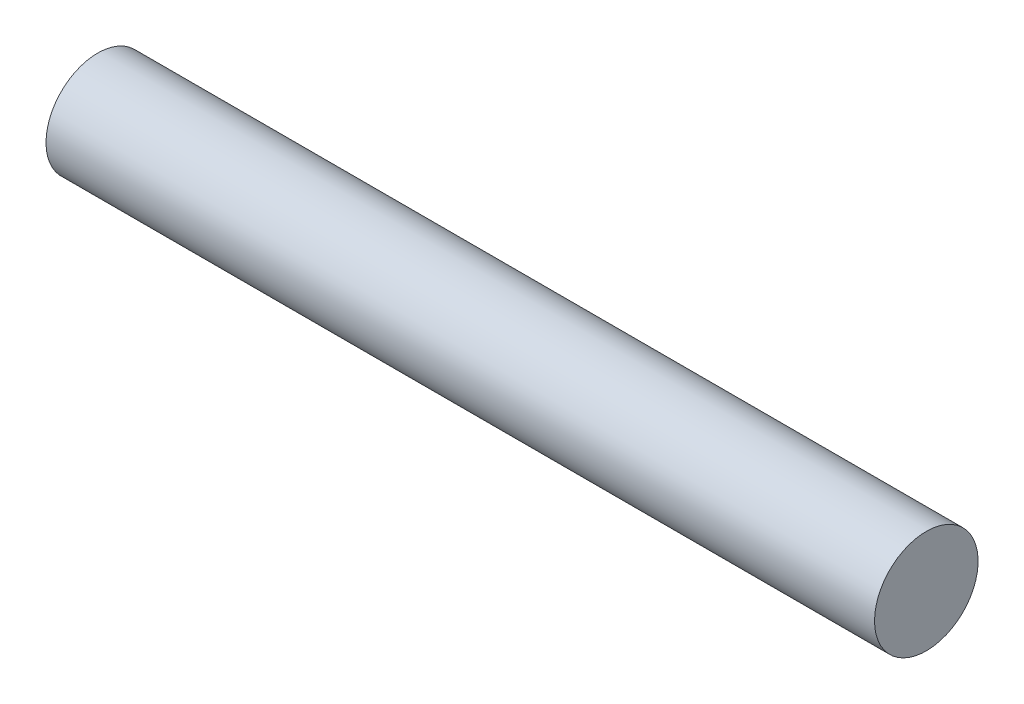
ISO-10303-21;
HEADER;
FILE_DESCRIPTION(('STEP AP214'),'2;1');
FILE_NAME('part.step','',(''),(''),'','','');
FILE_SCHEMA(('AUTOMOTIVE_DESIGN { 1 0 10303 214 1 1 1 1 }'));
ENDSEC;
DATA;
#1=APPLICATION_CONTEXT('core data for automotive mechanical design processes');
#2=APPLICATION_PROTOCOL_DEFINITION('international standard','automotive_design',2000,#1);
#3=PRODUCT_CONTEXT('',#1,'mechanical');
#4=PRODUCT('Part','Part','',(#3));
#5=PRODUCT_RELATED_PRODUCT_CATEGORY('part','',(#4));
#6=PRODUCT_DEFINITION_FORMATION('','',#4);
#7=PRODUCT_DEFINITION_CONTEXT('part definition',#1,'design');
#8=PRODUCT_DEFINITION('design','',#6,#7);
#9=PRODUCT_DEFINITION_SHAPE('','',#8);
#10=(LENGTH_UNIT() NAMED_UNIT(*) SI_UNIT(.MILLI.,.METRE.));
#11=(NAMED_UNIT(*) PLANE_ANGLE_UNIT() SI_UNIT($,.RADIAN.));
#12=(NAMED_UNIT(*) SI_UNIT($,.STERADIAN.) SOLID_ANGLE_UNIT());
#13=UNCERTAINTY_MEASURE_WITH_UNIT(LENGTH_MEASURE(1.E-05),#10,'distance_accuracy_value','');
#14=(GEOMETRIC_REPRESENTATION_CONTEXT(3) GLOBAL_UNCERTAINTY_ASSIGNED_CONTEXT((#13)) GLOBAL_UNIT_ASSIGNED_CONTEXT((#10,
#11,#12)) REPRESENTATION_CONTEXT('',''));
#15=CARTESIAN_POINT('',(0.,0.,0.));
#16=DIRECTION('',(0.,0.,1.));
#17=DIRECTION('',(1.,0.,0.));
#18=AXIS2_PLACEMENT_3D('',#15,#16,#17);
#19=CARTESIAN_POINT('',(19.05,0.,0.));
#20=DIRECTION('',(-1.,0.,0.));
#21=DIRECTION('',(0.,0.,1.));
#22=AXIS2_PLACEMENT_3D('',#19,#20,#21);
#23=CYLINDRICAL_SURFACE('',#22,1.190625);
#24=CARTESIAN_POINT('',(19.05,0.,0.));
#25=DIRECTION('',(1.,0.,0.));
#26=DIRECTION('',(0.,0.,-1.));
#27=AXIS2_PLACEMENT_3D('',#24,#25,#26);
#28=CIRCLE('',#27,1.190625);
#29=CARTESIAN_POINT('',(19.05,0.,1.190625));
#30=VERTEX_POINT('',#29);
#31=EDGE_CURVE('E10',#30,#30,#28,.T.);
#32=CARTESIAN_POINT('',(0.,0.,0.));
#33=DIRECTION('',(1.,0.,0.));
#34=DIRECTION('',(0.,0.,-1.));
#35=AXIS2_PLACEMENT_3D('',#32,#33,#34);
#36=CIRCLE('',#35,1.190625);
#37=CARTESIAN_POINT('',(0.,0.,1.190625));
#38=VERTEX_POINT('',#37);
#39=EDGE_CURVE('E34',#38,#38,#36,.T.);
#40=CARTESIAN_POINT('',(19.05,0.,1.190625));
#41=CARTESIAN_POINT('',(18.8515625,0.,1.190625));
#42=CARTESIAN_POINT('',(18.653125,0.,1.190625));
#43=CARTESIAN_POINT('',(18.25625,0.,1.190625));
#44=CARTESIAN_POINT('',(18.0578125,0.,1.190625));
#45=CARTESIAN_POINT('',(17.6609375,0.,1.190625));
#46=CARTESIAN_POINT('',(17.4625,0.,1.190625));
#47=CARTESIAN_POINT('',(17.065625,0.,1.190625));
#48=CARTESIAN_POINT('',(16.8671875,0.,1.190625));
#49=CARTESIAN_POINT('',(16.4703125,0.,1.190625));
#50=CARTESIAN_POINT('',(16.271875,0.,1.190625));
#51=CARTESIAN_POINT('',(15.875,0.,1.190625));
#52=CARTESIAN_POINT('',(15.6765625,0.,1.190625));
#53=CARTESIAN_POINT('',(15.2796875,0.,1.190625));
#54=CARTESIAN_POINT('',(15.08125,0.,1.190625));
#55=CARTESIAN_POINT('',(14.684375,0.,1.190625));
#56=CARTESIAN_POINT('',(14.4859375,0.,1.190625));
#57=CARTESIAN_POINT('',(14.0890625,0.,1.190625));
#58=CARTESIAN_POINT('',(13.890625,0.,1.190625));
#59=CARTESIAN_POINT('',(13.49375,0.,1.190625));
#60=CARTESIAN_POINT('',(13.2953125,0.,1.190625));
#61=CARTESIAN_POINT('',(12.8984375,0.,1.190625));
#62=CARTESIAN_POINT('',(12.7,0.,1.190625));
#63=CARTESIAN_POINT('',(12.303125,0.,1.190625));
#64=CARTESIAN_POINT('',(12.1046875,0.,1.190625));
#65=CARTESIAN_POINT('',(11.7078125,0.,1.190625));
#66=CARTESIAN_POINT('',(11.509375,0.,1.190625));
#67=CARTESIAN_POINT('',(11.1125,0.,1.190625));
#68=CARTESIAN_POINT('',(10.9140625,0.,1.190625));
#69=CARTESIAN_POINT('',(10.5171875,0.,1.190625));
#70=CARTESIAN_POINT('',(10.31875,0.,1.190625));
#71=CARTESIAN_POINT('',(9.921875,0.,1.190625));
#72=CARTESIAN_POINT('',(9.7234375,0.,1.190625));
#73=CARTESIAN_POINT('',(9.3265625,0.,1.190625));
#74=CARTESIAN_POINT('',(9.128125,0.,1.190625));
#75=CARTESIAN_POINT('',(8.73125,0.,1.190625));
#76=CARTESIAN_POINT('',(8.5328125,0.,1.190625));
#77=CARTESIAN_POINT('',(8.1359375,0.,1.190625));
#78=CARTESIAN_POINT('',(7.9375,0.,1.190625));
#79=CARTESIAN_POINT('',(7.540625,0.,1.190625));
#80=CARTESIAN_POINT('',(7.3421875,0.,1.190625));
#81=CARTESIAN_POINT('',(6.9453125,0.,1.190625));
#82=CARTESIAN_POINT('',(6.746875,0.,1.190625));
#83=CARTESIAN_POINT('',(6.35,0.,1.190625));
#84=CARTESIAN_POINT('',(6.1515625,0.,1.190625));
#85=CARTESIAN_POINT('',(5.7546875,0.,1.190625));
#86=CARTESIAN_POINT('',(5.55625,0.,1.190625));
#87=CARTESIAN_POINT('',(5.159375,0.,1.190625));
#88=CARTESIAN_POINT('',(4.9609375,0.,1.190625));
#89=CARTESIAN_POINT('',(4.5640625,0.,1.190625));
#90=CARTESIAN_POINT('',(4.365625,0.,1.190625));
#91=CARTESIAN_POINT('',(3.96875,0.,1.190625));
#92=CARTESIAN_POINT('',(3.7703125,0.,1.190625));
#93=CARTESIAN_POINT('',(3.3734375,0.,1.190625));
#94=CARTESIAN_POINT('',(3.175,0.,1.190625));
#95=CARTESIAN_POINT('',(2.778125,0.,1.190625));
#96=CARTESIAN_POINT('',(2.5796875,0.,1.190625));
#97=CARTESIAN_POINT('',(2.1828125,0.,1.190625));
#98=CARTESIAN_POINT('',(1.984375,0.,1.190625));
#99=CARTESIAN_POINT('',(1.5875,0.,1.190625));
#100=CARTESIAN_POINT('',(1.3890625,0.,1.190625));
#101=CARTESIAN_POINT('',(0.992187500000001,0.,1.190625));
#102=CARTESIAN_POINT('',(0.793750000000001,0.,1.190625));
#103=CARTESIAN_POINT('',(0.396875,0.,1.190625));
#104=CARTESIAN_POINT('',(0.1984375,0.,1.190625));
#105=CARTESIAN_POINT('',(0.,0.,1.190625));
#106=B_SPLINE_CURVE_WITH_KNOTS('',3,(#40,#41,#42,#43,#44,#45,#46,#47,#48,#49,#50,#51,#52,#53,
#54,#55,#56,#57,#58,#59,#60,#61,#62,#63,#64,#65,#66,#67,#68,#69,#70,#71,#72,#73,#74,#75,#76,#77,
#78,#79,#80,#81,#82,#83,#84,#85,#86,#87,#88,#89,#90,#91,#92,#93,#94,#95,#96,#97,#98,#99,#100,
#101,#102,#103,#104,#105),.UNSPECIFIED.,.F.,.F.,(4,2,2,2,2,2,2,2,2,2,2,2,2,2,2,2,2,2,2,2,2,2,2,
2,2,2,2,2,2,2,2,2,4),(0.,0.5953125,1.190625,1.7859375,2.38125,2.9765625,3.571875,4.1671875,
4.7625,5.3578125,5.953125,6.5484375,7.14375,7.7390625,8.334375,8.9296875,9.525,10.1203125,
10.715625,11.3109375,11.90625,12.5015625,13.096875,13.6921875,14.2875,14.8828125,15.478125,
16.0734375,16.66875,17.2640625,17.859375,18.4546875,19.05),.UNSPECIFIED.);
#107=EDGE_CURVE('BSEAM31',#30,#38,#106,.T.);
#108=ORIENTED_EDGE('',*,*,#31,.F.);
#109=ORIENTED_EDGE('',*,*,#39,.T.);
#110=ORIENTED_EDGE('',*,*,#107,.T.);
#111=ORIENTED_EDGE('',*,*,#107,.F.);
#112=EDGE_LOOP('',(#108,#110,#109,#111));
#113=FACE_BOUND('',#112,.T.);
#114=ADVANCED_FACE('F31',(#113),#23,.T.);
#115=CARTESIAN_POINT('',(19.05,0.,0.));
#116=DIRECTION('',(1.,0.,0.));
#117=DIRECTION('',(0.,0.,-1.));
#118=AXIS2_PLACEMENT_3D('',#115,#116,#117);
#119=PLANE('',#118);
#120=ORIENTED_EDGE('',*,*,#31,.T.);
#121=EDGE_LOOP('',(#120));
#122=FACE_BOUND('',#121,.T.);
#123=ADVANCED_FACE('F46',(#122),#119,.T.);
#124=CARTESIAN_POINT('',(0.,0.,0.));
#125=DIRECTION('',(1.,0.,0.));
#126=DIRECTION('',(0.,0.,-1.));
#127=AXIS2_PLACEMENT_3D('',#124,#125,#126);
#128=PLANE('',#127);
#129=ORIENTED_EDGE('',*,*,#39,.F.);
#130=EDGE_LOOP('',(#129));
#131=FACE_BOUND('',#130,.T.);
#132=ADVANCED_FACE('F44',(#131),#128,.F.);
#133=CLOSED_SHELL('',(#114,#123,#132));
#134=MANIFOLD_SOLID_BREP('B2',#133);
#135=ADVANCED_BREP_SHAPE_REPRESENTATION('',(#18,#134),#14);
#136=SHAPE_DEFINITION_REPRESENTATION(#9,#135);
ENDSEC;
END-ISO-10303-21;
